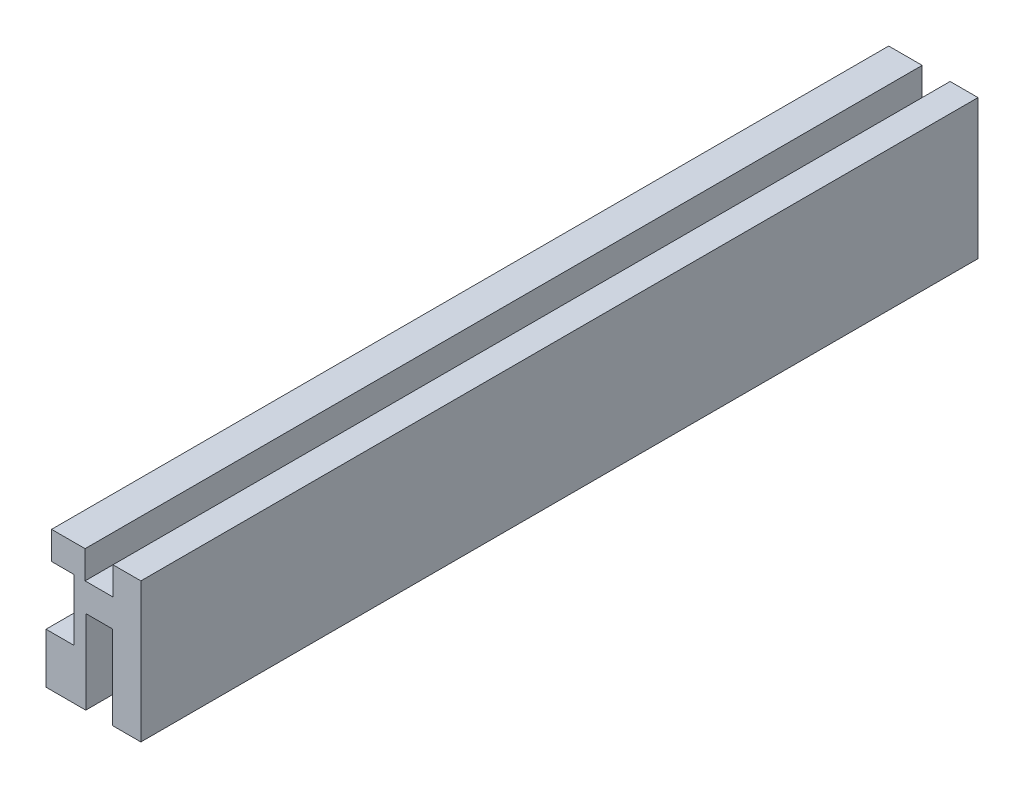
ISO-10303-21;
HEADER;
FILE_DESCRIPTION(('STEP AP214'),'2;1');
FILE_NAME('part.step','',(''),(''),'','','');
FILE_SCHEMA(('AUTOMOTIVE_DESIGN { 1 0 10303 214 1 1 1 1 }'));
ENDSEC;
DATA;
#1=APPLICATION_CONTEXT('core data for automotive mechanical design processes');
#2=APPLICATION_PROTOCOL_DEFINITION('international standard','automotive_design',2000,#1);
#3=PRODUCT_CONTEXT('',#1,'mechanical');
#4=PRODUCT('Part','Part','',(#3));
#5=PRODUCT_RELATED_PRODUCT_CATEGORY('part','',(#4));
#6=PRODUCT_DEFINITION_FORMATION('','',#4);
#7=PRODUCT_DEFINITION_CONTEXT('part definition',#1,'design');
#8=PRODUCT_DEFINITION('design','',#6,#7);
#9=PRODUCT_DEFINITION_SHAPE('','',#8);
#10=(LENGTH_UNIT() NAMED_UNIT(*) SI_UNIT(.MILLI.,.METRE.));
#11=(NAMED_UNIT(*) PLANE_ANGLE_UNIT() SI_UNIT($,.RADIAN.));
#12=(NAMED_UNIT(*) SI_UNIT($,.STERADIAN.) SOLID_ANGLE_UNIT());
#13=UNCERTAINTY_MEASURE_WITH_UNIT(LENGTH_MEASURE(1.E-05),#10,'distance_accuracy_value','');
#14=(GEOMETRIC_REPRESENTATION_CONTEXT(3) GLOBAL_UNCERTAINTY_ASSIGNED_CONTEXT((#13)) GLOBAL_UNIT_ASSIGNED_CONTEXT((#10,
#11,#12)) REPRESENTATION_CONTEXT('',''));
#15=CARTESIAN_POINT('',(0.,0.,0.));
#16=DIRECTION('',(0.,0.,1.));
#17=DIRECTION('',(1.,0.,0.));
#18=AXIS2_PLACEMENT_3D('',#15,#16,#17);
#19=CARTESIAN_POINT('',(15.,-25.,300.));
#20=DIRECTION('',(0.,1.,0.));
#21=DIRECTION('',(-1.,0.,0.));
#22=AXIS2_PLACEMENT_3D('',#19,#20,#21);
#23=PLANE('',#22);
#24=DIRECTION('',(1.,0.,0.));
#25=VECTOR('',#24,1.);
#26=CARTESIAN_POINT('',(15.,-25.,0.));
#27=LINE('',#26,#25);
#28=CARTESIAN_POINT('',(4.75000000000001,-25.,0.));
#29=VERTEX_POINT('',#28);
#30=CARTESIAN_POINT('',(15.,-25.,0.));
#31=VERTEX_POINT('',#30);
#32=EDGE_CURVE('E182',#29,#31,#27,.T.);
#33=ORIENTED_EDGE('',*,*,#32,.T.);
#34=DIRECTION('',(0.,0.,-1.));
#35=VECTOR('',#34,1.);
#36=CARTESIAN_POINT('',(15.,-25.,300.));
#37=LINE('',#36,#35);
#38=CARTESIAN_POINT('',(15.,-25.,300.));
#39=VERTEX_POINT('',#38);
#40=EDGE_CURVE('E11',#39,#31,#37,.T.);
#41=ORIENTED_EDGE('',*,*,#40,.F.);
#42=DIRECTION('',(1.,0.,0.));
#43=VECTOR('',#42,1.);
#44=CARTESIAN_POINT('',(15.,-25.,300.));
#45=LINE('',#44,#43);
#46=CARTESIAN_POINT('',(4.75000000000001,-25.,300.));
#47=VERTEX_POINT('',#46);
#48=EDGE_CURVE('E212',#47,#39,#45,.T.);
#49=ORIENTED_EDGE('',*,*,#48,.F.);
#50=DIRECTION('',(0.,0.,-1.));
#51=VECTOR('',#50,1.);
#52=CARTESIAN_POINT('',(4.75000000000001,-25.,300.));
#53=LINE('',#52,#51);
#54=EDGE_CURVE('E178',#47,#29,#53,.T.);
#55=ORIENTED_EDGE('',*,*,#54,.T.);
#56=EDGE_LOOP('',(#33,#41,#49,#55));
#57=FACE_BOUND('',#56,.T.);
#58=ADVANCED_FACE('F38',(#57),#23,.F.);
#59=CARTESIAN_POINT('',(15.,25.,300.));
#60=DIRECTION('',(-1.,0.,0.));
#61=DIRECTION('',(0.,-1.,0.));
#62=AXIS2_PLACEMENT_3D('',#59,#60,#61);
#63=PLANE('',#62);
#64=DIRECTION('',(0.,1.,0.));
#65=VECTOR('',#64,1.);
#66=CARTESIAN_POINT('',(15.,25.,0.));
#67=LINE('',#66,#65);
#68=CARTESIAN_POINT('',(15.,25.,0.));
#69=VERTEX_POINT('',#68);
#70=EDGE_CURVE('E185',#31,#69,#67,.T.);
#71=ORIENTED_EDGE('',*,*,#70,.T.);
#72=DIRECTION('',(0.,0.,-1.));
#73=VECTOR('',#72,1.);
#74=CARTESIAN_POINT('',(15.,25.,300.));
#75=LINE('',#74,#73);
#76=CARTESIAN_POINT('',(15.,25.,300.));
#77=VERTEX_POINT('',#76);
#78=EDGE_CURVE('E46',#77,#69,#75,.T.);
#79=ORIENTED_EDGE('',*,*,#78,.F.);
#80=DIRECTION('',(0.,1.,0.));
#81=VECTOR('',#80,1.);
#82=CARTESIAN_POINT('',(15.,25.,300.));
#83=LINE('',#82,#81);
#84=EDGE_CURVE('E121',#39,#77,#83,.T.);
#85=ORIENTED_EDGE('',*,*,#84,.F.);
#86=ORIENTED_EDGE('',*,*,#40,.T.);
#87=EDGE_LOOP('',(#71,#79,#85,#86));
#88=FACE_BOUND('',#87,.T.);
#89=ADVANCED_FACE('F310',(#88),#63,.F.);
#90=CARTESIAN_POINT('',(15.,25.,300.));
#91=DIRECTION('',(0.,-1.,0.));
#92=DIRECTION('',(1.,0.,0.));
#93=AXIS2_PLACEMENT_3D('',#90,#91,#92);
#94=PLANE('',#93);
#95=DIRECTION('',(-1.,0.,0.));
#96=VECTOR('',#95,1.);
#97=CARTESIAN_POINT('',(15.,25.,0.));
#98=LINE('',#97,#96);
#99=CARTESIAN_POINT('',(5.00000000000001,25.,0.));
#100=VERTEX_POINT('',#99);
#101=EDGE_CURVE('E187',#69,#100,#98,.T.);
#102=ORIENTED_EDGE('',*,*,#101,.T.);
#103=DIRECTION('',(0.,0.,-1.));
#104=VECTOR('',#103,1.);
#105=CARTESIAN_POINT('',(5.00000000000001,25.,300.));
#106=LINE('',#105,#104);
#107=CARTESIAN_POINT('',(5.00000000000001,25.,300.));
#108=VERTEX_POINT('',#107);
#109=EDGE_CURVE('E243',#108,#100,#106,.T.);
#110=ORIENTED_EDGE('',*,*,#109,.F.);
#111=DIRECTION('',(-1.,0.,0.));
#112=VECTOR('',#111,1.);
#113=CARTESIAN_POINT('',(15.,25.,300.));
#114=LINE('',#113,#112);
#115=EDGE_CURVE('E251',#77,#108,#114,.T.);
#116=ORIENTED_EDGE('',*,*,#115,.F.);
#117=ORIENTED_EDGE('',*,*,#78,.T.);
#118=EDGE_LOOP('',(#102,#110,#116,#117));
#119=FACE_BOUND('',#118,.T.);
#120=ADVANCED_FACE('F249',(#119),#94,.F.);
#121=CARTESIAN_POINT('',(5.00000000000001,25.,300.));
#122=DIRECTION('',(1.,0.,0.));
#123=DIRECTION('',(0.,1.,0.));
#124=AXIS2_PLACEMENT_3D('',#121,#122,#123);
#125=PLANE('',#124);
#126=DIRECTION('',(0.,-1.,0.));
#127=VECTOR('',#126,1.);
#128=CARTESIAN_POINT('',(5.00000000000001,25.,0.));
#129=LINE('',#128,#127);
#130=CARTESIAN_POINT('',(5.00000000000001,15.,0.));
#131=VERTEX_POINT('',#130);
#132=EDGE_CURVE('E189',#100,#131,#129,.T.);
#133=ORIENTED_EDGE('',*,*,#132,.T.);
#134=DIRECTION('',(0.,0.,-1.));
#135=VECTOR('',#134,1.);
#136=CARTESIAN_POINT('',(5.00000000000001,15.,300.));
#137=LINE('',#136,#135);
#138=CARTESIAN_POINT('',(5.00000000000001,15.,300.));
#139=VERTEX_POINT('',#138);
#140=EDGE_CURVE('E240',#139,#131,#137,.T.);
#141=ORIENTED_EDGE('',*,*,#140,.F.);
#142=DIRECTION('',(0.,-1.,0.));
#143=VECTOR('',#142,1.);
#144=CARTESIAN_POINT('',(5.00000000000001,25.,300.));
#145=LINE('',#144,#143);
#146=EDGE_CURVE('E269',#108,#139,#145,.T.);
#147=ORIENTED_EDGE('',*,*,#146,.F.);
#148=ORIENTED_EDGE('',*,*,#109,.T.);
#149=EDGE_LOOP('',(#133,#141,#147,#148));
#150=FACE_BOUND('',#149,.T.);
#151=ADVANCED_FACE('F260',(#150),#125,.F.);
#152=CARTESIAN_POINT('',(-5.,15.,300.));
#153=DIRECTION('',(0.,-1.,0.));
#154=DIRECTION('',(0.,0.,-1.));
#155=AXIS2_PLACEMENT_3D('',#152,#153,#154);
#156=PLANE('',#155);
#157=DIRECTION('',(-1.,0.,0.));
#158=VECTOR('',#157,1.);
#159=CARTESIAN_POINT('',(-5.,15.,0.));
#160=LINE('',#159,#158);
#161=CARTESIAN_POINT('',(-5.,15.,0.));
#162=VERTEX_POINT('',#161);
#163=EDGE_CURVE('E191',#131,#162,#160,.T.);
#164=ORIENTED_EDGE('',*,*,#163,.T.);
#165=DIRECTION('',(0.,0.,-1.));
#166=VECTOR('',#165,1.);
#167=CARTESIAN_POINT('',(-5.,15.,300.));
#168=LINE('',#167,#166);
#169=CARTESIAN_POINT('',(-5.,15.,300.));
#170=VERTEX_POINT('',#169);
#171=EDGE_CURVE('E237',#170,#162,#168,.T.);
#172=ORIENTED_EDGE('',*,*,#171,.F.);
#173=DIRECTION('',(-1.,0.,0.));
#174=VECTOR('',#173,1.);
#175=CARTESIAN_POINT('',(-5.,15.,300.));
#176=LINE('',#175,#174);
#177=EDGE_CURVE('E266',#139,#170,#176,.T.);
#178=ORIENTED_EDGE('',*,*,#177,.F.);
#179=ORIENTED_EDGE('',*,*,#140,.T.);
#180=EDGE_LOOP('',(#164,#172,#178,#179));
#181=FACE_BOUND('',#180,.T.);
#182=ADVANCED_FACE('F264',(#181),#156,.F.);
#183=CARTESIAN_POINT('',(-5.,25.,300.));
#184=DIRECTION('',(-1.,0.,0.));
#185=DIRECTION('',(0.,-1.,0.));
#186=AXIS2_PLACEMENT_3D('',#183,#184,#185);
#187=PLANE('',#186);
#188=DIRECTION('',(0.,1.,0.));
#189=VECTOR('',#188,1.);
#190=CARTESIAN_POINT('',(-5.,25.,0.));
#191=LINE('',#190,#189);
#192=CARTESIAN_POINT('',(-5.,25.,0.));
#193=VERTEX_POINT('',#192);
#194=EDGE_CURVE('E193',#162,#193,#191,.T.);
#195=ORIENTED_EDGE('',*,*,#194,.T.);
#196=DIRECTION('',(0.,0.,-1.));
#197=VECTOR('',#196,1.);
#198=CARTESIAN_POINT('',(-5.,25.,300.));
#199=LINE('',#198,#197);
#200=CARTESIAN_POINT('',(-5.,25.,300.));
#201=VERTEX_POINT('',#200);
#202=EDGE_CURVE('E234',#201,#193,#199,.T.);
#203=ORIENTED_EDGE('',*,*,#202,.F.);
#204=DIRECTION('',(0.,1.,0.));
#205=VECTOR('',#204,1.);
#206=CARTESIAN_POINT('',(-5.,25.,300.));
#207=LINE('',#206,#205);
#208=EDGE_CURVE('E268',#170,#201,#207,.T.);
#209=ORIENTED_EDGE('',*,*,#208,.F.);
#210=ORIENTED_EDGE('',*,*,#171,.T.);
#211=EDGE_LOOP('',(#195,#203,#209,#210));
#212=FACE_BOUND('',#211,.T.);
#213=ADVANCED_FACE('F323',(#212),#187,.F.);
#214=CARTESIAN_POINT('',(-5.,25.,300.));
#215=DIRECTION('',(0.,-1.,0.));
#216=DIRECTION('',(0.,0.,-1.));
#217=AXIS2_PLACEMENT_3D('',#214,#215,#216);
#218=PLANE('',#217);
#219=DIRECTION('',(-1.,0.,0.));
#220=VECTOR('',#219,1.);
#221=CARTESIAN_POINT('',(-5.,25.,0.));
#222=LINE('',#221,#220);
#223=CARTESIAN_POINT('',(-17.,25.,0.));
#224=VERTEX_POINT('',#223);
#225=EDGE_CURVE('E195',#193,#224,#222,.T.);
#226=ORIENTED_EDGE('',*,*,#225,.T.);
#227=DIRECTION('',(0.,0.,-1.));
#228=VECTOR('',#227,1.);
#229=CARTESIAN_POINT('',(-17.,25.,300.));
#230=LINE('',#229,#228);
#231=CARTESIAN_POINT('',(-17.,25.,300.));
#232=VERTEX_POINT('',#231);
#233=EDGE_CURVE('E231',#232,#224,#230,.T.);
#234=ORIENTED_EDGE('',*,*,#233,.F.);
#235=DIRECTION('',(-1.,0.,0.));
#236=VECTOR('',#235,1.);
#237=CARTESIAN_POINT('',(-5.,25.,300.));
#238=LINE('',#237,#236);
#239=EDGE_CURVE('E271',#201,#232,#238,.T.);
#240=ORIENTED_EDGE('',*,*,#239,.F.);
#241=ORIENTED_EDGE('',*,*,#202,.T.);
#242=EDGE_LOOP('',(#226,#234,#240,#241));
#243=FACE_BOUND('',#242,.T.);
#244=ADVANCED_FACE('F326',(#243),#218,.F.);
#245=CARTESIAN_POINT('',(-17.,25.,300.));
#246=DIRECTION('',(1.,0.,0.));
#247=DIRECTION('',(0.,1.,0.));
#248=AXIS2_PLACEMENT_3D('',#245,#246,#247);
#249=PLANE('',#248);
#250=DIRECTION('',(0.,-1.,0.));
#251=VECTOR('',#250,1.);
#252=CARTESIAN_POINT('',(-17.,25.,0.));
#253=LINE('',#252,#251);
#254=CARTESIAN_POINT('',(-17.,15.,0.));
#255=VERTEX_POINT('',#254);
#256=EDGE_CURVE('E197',#224,#255,#253,.T.);
#257=ORIENTED_EDGE('',*,*,#256,.T.);
#258=DIRECTION('',(0.,0.,-1.));
#259=VECTOR('',#258,1.);
#260=CARTESIAN_POINT('',(-17.,15.,300.));
#261=LINE('',#260,#259);
#262=CARTESIAN_POINT('',(-17.,15.,300.));
#263=VERTEX_POINT('',#262);
#264=EDGE_CURVE('E228',#263,#255,#261,.T.);
#265=ORIENTED_EDGE('',*,*,#264,.F.);
#266=DIRECTION('',(0.,-1.,0.));
#267=VECTOR('',#266,1.);
#268=CARTESIAN_POINT('',(-17.,25.,300.));
#269=LINE('',#268,#267);
#270=EDGE_CURVE('E277',#232,#263,#269,.T.);
#271=ORIENTED_EDGE('',*,*,#270,.F.);
#272=ORIENTED_EDGE('',*,*,#233,.T.);
#273=EDGE_LOOP('',(#257,#265,#271,#272));
#274=FACE_BOUND('',#273,.T.);
#275=ADVANCED_FACE('F330',(#274),#249,.F.);
#276=CARTESIAN_POINT('',(-17.,15.,300.));
#277=DIRECTION('',(0.,1.,0.));
#278=DIRECTION('',(0.,0.,1.));
#279=AXIS2_PLACEMENT_3D('',#276,#277,#278);
#280=PLANE('',#279);
#281=DIRECTION('',(1.,0.,0.));
#282=VECTOR('',#281,1.);
#283=CARTESIAN_POINT('',(-17.,15.,0.));
#284=LINE('',#283,#282);
#285=CARTESIAN_POINT('',(-8.99999999999999,15.,0.));
#286=VERTEX_POINT('',#285);
#287=EDGE_CURVE('E199',#255,#286,#284,.T.);
#288=ORIENTED_EDGE('',*,*,#287,.T.);
#289=DIRECTION('',(0.,0.,-1.));
#290=VECTOR('',#289,1.);
#291=CARTESIAN_POINT('',(-8.99999999999999,15.,300.));
#292=LINE('',#291,#290);
#293=CARTESIAN_POINT('',(-8.99999999999999,15.,300.));
#294=VERTEX_POINT('',#293);
#295=EDGE_CURVE('E225',#294,#286,#292,.T.);
#296=ORIENTED_EDGE('',*,*,#295,.F.);
#297=DIRECTION('',(1.,0.,0.));
#298=VECTOR('',#297,1.);
#299=CARTESIAN_POINT('',(-17.,15.,300.));
#300=LINE('',#299,#298);
#301=EDGE_CURVE('E279',#263,#294,#300,.T.);
#302=ORIENTED_EDGE('',*,*,#301,.F.);
#303=ORIENTED_EDGE('',*,*,#264,.T.);
#304=EDGE_LOOP('',(#288,#296,#302,#303));
#305=FACE_BOUND('',#304,.T.);
#306=ADVANCED_FACE('F334',(#305),#280,.F.);
#307=CARTESIAN_POINT('',(-8.99999999999999,15.,300.));
#308=DIRECTION('',(1.,0.,0.));
#309=DIRECTION('',(0.,1.,0.));
#310=AXIS2_PLACEMENT_3D('',#307,#308,#309);
#311=PLANE('',#310);
#312=DIRECTION('',(0.,-1.,0.));
#313=VECTOR('',#312,1.);
#314=CARTESIAN_POINT('',(-8.99999999999999,15.,0.));
#315=LINE('',#314,#313);
#316=CARTESIAN_POINT('',(-8.99999999999998,-7.,0.));
#317=VERTEX_POINT('',#316);
#318=EDGE_CURVE('E201',#286,#317,#315,.T.);
#319=ORIENTED_EDGE('',*,*,#318,.T.);
#320=DIRECTION('',(0.,0.,-1.));
#321=VECTOR('',#320,1.);
#322=CARTESIAN_POINT('',(-8.99999999999998,-7.,300.));
#323=LINE('',#322,#321);
#324=CARTESIAN_POINT('',(-8.99999999999998,-7.,300.));
#325=VERTEX_POINT('',#324);
#326=EDGE_CURVE('E222',#325,#317,#323,.T.);
#327=ORIENTED_EDGE('',*,*,#326,.F.);
#328=DIRECTION('',(0.,-1.,0.));
#329=VECTOR('',#328,1.);
#330=CARTESIAN_POINT('',(-8.99999999999999,15.,300.));
#331=LINE('',#330,#329);
#332=EDGE_CURVE('E281',#294,#325,#331,.T.);
#333=ORIENTED_EDGE('',*,*,#332,.F.);
#334=ORIENTED_EDGE('',*,*,#295,.T.);
#335=EDGE_LOOP('',(#319,#327,#333,#334));
#336=FACE_BOUND('',#335,.T.);
#337=ADVANCED_FACE('F338',(#336),#311,.F.);
#338=CARTESIAN_POINT('',(-8.99999999999998,-7.,300.));
#339=DIRECTION('',(0.,-1.,0.));
#340=DIRECTION('',(1.,0.,0.));
#341=AXIS2_PLACEMENT_3D('',#338,#339,#340);
#342=PLANE('',#341);
#343=DIRECTION('',(-1.,0.,0.));
#344=VECTOR('',#343,1.);
#345=CARTESIAN_POINT('',(-8.99999999999998,-7.,0.));
#346=LINE('',#345,#344);
#347=CARTESIAN_POINT('',(-19.,-7.,0.));
#348=VERTEX_POINT('',#347);
#349=EDGE_CURVE('E203',#317,#348,#346,.T.);
#350=ORIENTED_EDGE('',*,*,#349,.T.);
#351=DIRECTION('',(0.,0.,-1.));
#352=VECTOR('',#351,1.);
#353=CARTESIAN_POINT('',(-19.,-7.,300.));
#354=LINE('',#353,#352);
#355=CARTESIAN_POINT('',(-19.,-7.,300.));
#356=VERTEX_POINT('',#355);
#357=EDGE_CURVE('E219',#356,#348,#354,.T.);
#358=ORIENTED_EDGE('',*,*,#357,.F.);
#359=DIRECTION('',(-1.,0.,0.));
#360=VECTOR('',#359,1.);
#361=CARTESIAN_POINT('',(-8.99999999999998,-7.,300.));
#362=LINE('',#361,#360);
#363=EDGE_CURVE('E283',#325,#356,#362,.T.);
#364=ORIENTED_EDGE('',*,*,#363,.F.);
#365=ORIENTED_EDGE('',*,*,#326,.T.);
#366=EDGE_LOOP('',(#350,#358,#364,#365));
#367=FACE_BOUND('',#366,.T.);
#368=ADVANCED_FACE('F342',(#367),#342,.F.);
#369=CARTESIAN_POINT('',(-19.,-7.,300.));
#370=DIRECTION('',(1.,0.,0.));
#371=DIRECTION('',(0.,0.,-1.));
#372=AXIS2_PLACEMENT_3D('',#369,#370,#371);
#373=PLANE('',#372);
#374=DIRECTION('',(0.,-1.,0.));
#375=VECTOR('',#374,1.);
#376=CARTESIAN_POINT('',(-19.,-7.,0.));
#377=LINE('',#376,#375);
#378=CARTESIAN_POINT('',(-19.,-25.,0.));
#379=VERTEX_POINT('',#378);
#380=EDGE_CURVE('E205',#348,#379,#377,.T.);
#381=ORIENTED_EDGE('',*,*,#380,.T.);
#382=DIRECTION('',(0.,0.,-1.));
#383=VECTOR('',#382,1.);
#384=CARTESIAN_POINT('',(-19.,-25.,300.));
#385=LINE('',#384,#383);
#386=CARTESIAN_POINT('',(-19.,-25.,300.));
#387=VERTEX_POINT('',#386);
#388=EDGE_CURVE('E216',#387,#379,#385,.T.);
#389=ORIENTED_EDGE('',*,*,#388,.F.);
#390=DIRECTION('',(0.,-1.,0.));
#391=VECTOR('',#390,1.);
#392=CARTESIAN_POINT('',(-19.,-7.,300.));
#393=LINE('',#392,#391);
#394=EDGE_CURVE('E285',#356,#387,#393,.T.);
#395=ORIENTED_EDGE('',*,*,#394,.F.);
#396=ORIENTED_EDGE('',*,*,#357,.T.);
#397=EDGE_LOOP('',(#381,#389,#395,#396));
#398=FACE_BOUND('',#397,.T.);
#399=ADVANCED_FACE('F291',(#398),#373,.F.);
#400=CARTESIAN_POINT('',(-19.,-25.,300.));
#401=DIRECTION('',(0.,1.,0.));
#402=DIRECTION('',(0.,0.,1.));
#403=AXIS2_PLACEMENT_3D('',#400,#401,#402);
#404=PLANE('',#403);
#405=DIRECTION('',(1.,0.,0.));
#406=VECTOR('',#405,1.);
#407=CARTESIAN_POINT('',(-19.,-25.,0.));
#408=LINE('',#407,#406);
#409=CARTESIAN_POINT('',(-4.74999999999999,-25.,0.));
#410=VERTEX_POINT('',#409);
#411=EDGE_CURVE('E207',#379,#410,#408,.T.);
#412=ORIENTED_EDGE('',*,*,#411,.T.);
#413=DIRECTION('',(0.,0.,-1.));
#414=VECTOR('',#413,1.);
#415=CARTESIAN_POINT('',(-4.74999999999999,-25.,300.));
#416=LINE('',#415,#414);
#417=CARTESIAN_POINT('',(-4.74999999999999,-25.,300.));
#418=VERTEX_POINT('',#417);
#419=EDGE_CURVE('E173',#418,#410,#416,.T.);
#420=ORIENTED_EDGE('',*,*,#419,.F.);
#421=DIRECTION('',(1.,0.,0.));
#422=VECTOR('',#421,1.);
#423=CARTESIAN_POINT('',(-19.,-25.,300.));
#424=LINE('',#423,#422);
#425=EDGE_CURVE('E164',#387,#418,#424,.T.);
#426=ORIENTED_EDGE('',*,*,#425,.F.);
#427=ORIENTED_EDGE('',*,*,#388,.T.);
#428=EDGE_LOOP('',(#412,#420,#426,#427));
#429=FACE_BOUND('',#428,.T.);
#430=ADVANCED_FACE('F295',(#429),#404,.F.);
#431=CARTESIAN_POINT('',(-4.74999999999999,-25.,300.));
#432=DIRECTION('',(-1.,0.,0.));
#433=DIRECTION('',(0.,0.,1.));
#434=AXIS2_PLACEMENT_3D('',#431,#432,#433);
#435=PLANE('',#434);
#436=DIRECTION('',(0.,1.,0.));
#437=VECTOR('',#436,1.);
#438=CARTESIAN_POINT('',(-4.74999999999999,-25.,0.));
#439=LINE('',#438,#437);
#440=CARTESIAN_POINT('',(-4.74999999999999,5.,0.));
#441=VERTEX_POINT('',#440);
#442=EDGE_CURVE('E172',#410,#441,#439,.T.);
#443=ORIENTED_EDGE('',*,*,#442,.T.);
#444=DIRECTION('',(0.,0.,-1.));
#445=VECTOR('',#444,1.);
#446=CARTESIAN_POINT('',(-4.74999999999999,5.,300.));
#447=LINE('',#446,#445);
#448=CARTESIAN_POINT('',(-4.74999999999999,5.,300.));
#449=VERTEX_POINT('',#448);
#450=EDGE_CURVE('E169',#449,#441,#447,.T.);
#451=ORIENTED_EDGE('',*,*,#450,.F.);
#452=DIRECTION('',(0.,1.,0.));
#453=VECTOR('',#452,1.);
#454=CARTESIAN_POINT('',(-4.74999999999999,-25.,300.));
#455=LINE('',#454,#453);
#456=EDGE_CURVE('E158',#418,#449,#455,.T.);
#457=ORIENTED_EDGE('',*,*,#456,.F.);
#458=ORIENTED_EDGE('',*,*,#419,.T.);
#459=EDGE_LOOP('',(#443,#451,#457,#458));
#460=FACE_BOUND('',#459,.T.);
#461=ADVANCED_FACE('F170',(#460),#435,.F.);
#462=CARTESIAN_POINT('',(-4.74999999999999,5.,300.));
#463=DIRECTION('',(0.,1.,0.));
#464=DIRECTION('',(0.,0.,1.));
#465=AXIS2_PLACEMENT_3D('',#462,#463,#464);
#466=PLANE('',#465);
#467=DIRECTION('',(1.,0.,0.));
#468=VECTOR('',#467,1.);
#469=CARTESIAN_POINT('',(-4.74999999999999,5.,0.));
#470=LINE('',#469,#468);
#471=CARTESIAN_POINT('',(4.75000000000001,5.,0.));
#472=VERTEX_POINT('',#471);
#473=EDGE_CURVE('E107',#441,#472,#470,.T.);
#474=ORIENTED_EDGE('',*,*,#473,.T.);
#475=DIRECTION('',(0.,0.,-1.));
#476=VECTOR('',#475,1.);
#477=CARTESIAN_POINT('',(4.75000000000001,5.,300.));
#478=LINE('',#477,#476);
#479=CARTESIAN_POINT('',(4.75000000000001,5.,300.));
#480=VERTEX_POINT('',#479);
#481=EDGE_CURVE('E174',#480,#472,#478,.T.);
#482=ORIENTED_EDGE('',*,*,#481,.F.);
#483=DIRECTION('',(1.,0.,0.));
#484=VECTOR('',#483,1.);
#485=CARTESIAN_POINT('',(-4.74999999999999,5.,300.));
#486=LINE('',#485,#484);
#487=EDGE_CURVE('E162',#449,#480,#486,.T.);
#488=ORIENTED_EDGE('',*,*,#487,.F.);
#489=ORIENTED_EDGE('',*,*,#450,.T.);
#490=EDGE_LOOP('',(#474,#482,#488,#489));
#491=FACE_BOUND('',#490,.T.);
#492=ADVANCED_FACE('F176',(#491),#466,.F.);
#493=CARTESIAN_POINT('',(4.75000000000001,-25.,300.));
#494=DIRECTION('',(1.,0.,0.));
#495=DIRECTION('',(0.,0.,-1.));
#496=AXIS2_PLACEMENT_3D('',#493,#494,#495);
#497=PLANE('',#496);
#498=DIRECTION('',(0.,-1.,0.));
#499=VECTOR('',#498,1.);
#500=CARTESIAN_POINT('',(4.75000000000001,-25.,0.));
#501=LINE('',#500,#499);
#502=EDGE_CURVE('E113',#472,#29,#501,.T.);
#503=ORIENTED_EDGE('',*,*,#502,.T.);
#504=ORIENTED_EDGE('',*,*,#54,.F.);
#505=DIRECTION('',(0.,-1.,0.));
#506=VECTOR('',#505,1.);
#507=CARTESIAN_POINT('',(4.75000000000001,-25.,300.));
#508=LINE('',#507,#506);
#509=EDGE_CURVE('E54',#480,#47,#508,.T.);
#510=ORIENTED_EDGE('',*,*,#509,.F.);
#511=ORIENTED_EDGE('',*,*,#481,.T.);
#512=EDGE_LOOP('',(#503,#504,#510,#511));
#513=FACE_BOUND('',#512,.T.);
#514=ADVANCED_FACE('F299',(#513),#497,.F.);
#515=CARTESIAN_POINT('',(0.,0.,300.));
#516=DIRECTION('',(0.,0.,-1.));
#517=DIRECTION('',(-1.,0.,0.));
#518=AXIS2_PLACEMENT_3D('',#515,#516,#517);
#519=PLANE('',#518);
#520=ORIENTED_EDGE('',*,*,#48,.T.);
#521=ORIENTED_EDGE('',*,*,#84,.T.);
#522=ORIENTED_EDGE('',*,*,#115,.T.);
#523=ORIENTED_EDGE('',*,*,#146,.T.);
#524=ORIENTED_EDGE('',*,*,#177,.T.);
#525=ORIENTED_EDGE('',*,*,#208,.T.);
#526=ORIENTED_EDGE('',*,*,#239,.T.);
#527=ORIENTED_EDGE('',*,*,#270,.T.);
#528=ORIENTED_EDGE('',*,*,#301,.T.);
#529=ORIENTED_EDGE('',*,*,#332,.T.);
#530=ORIENTED_EDGE('',*,*,#363,.T.);
#531=ORIENTED_EDGE('',*,*,#394,.T.);
#532=ORIENTED_EDGE('',*,*,#425,.T.);
#533=ORIENTED_EDGE('',*,*,#456,.T.);
#534=ORIENTED_EDGE('',*,*,#487,.T.);
#535=ORIENTED_EDGE('',*,*,#509,.T.);
#536=EDGE_LOOP('',(#520,#521,#522,#523,#524,#525,#526,#527,#528,#529,#530,#531,#532,#533,#534,#535));
#537=FACE_BOUND('',#536,.T.);
#538=ADVANCED_FACE('F160',(#537),#519,.F.);
#539=CARTESIAN_POINT('',(0.,0.,0.));
#540=DIRECTION('',(0.,0.,-1.));
#541=DIRECTION('',(-1.,0.,0.));
#542=AXIS2_PLACEMENT_3D('',#539,#540,#541);
#543=PLANE('',#542);
#544=ORIENTED_EDGE('',*,*,#32,.F.);
#545=ORIENTED_EDGE('',*,*,#502,.F.);
#546=ORIENTED_EDGE('',*,*,#473,.F.);
#547=ORIENTED_EDGE('',*,*,#442,.F.);
#548=ORIENTED_EDGE('',*,*,#411,.F.);
#549=ORIENTED_EDGE('',*,*,#380,.F.);
#550=ORIENTED_EDGE('',*,*,#349,.F.);
#551=ORIENTED_EDGE('',*,*,#318,.F.);
#552=ORIENTED_EDGE('',*,*,#287,.F.);
#553=ORIENTED_EDGE('',*,*,#256,.F.);
#554=ORIENTED_EDGE('',*,*,#225,.F.);
#555=ORIENTED_EDGE('',*,*,#194,.F.);
#556=ORIENTED_EDGE('',*,*,#163,.F.);
#557=ORIENTED_EDGE('',*,*,#132,.F.);
#558=ORIENTED_EDGE('',*,*,#101,.F.);
#559=ORIENTED_EDGE('',*,*,#70,.F.);
#560=EDGE_LOOP('',(#544,#545,#546,#547,#548,#549,#550,#551,#552,#553,#554,#555,#556,#557,#558,#559));
#561=FACE_BOUND('',#560,.T.);
#562=ADVANCED_FACE('F255',(#561),#543,.T.);
#563=CLOSED_SHELL('',(#58,#89,#120,#151,#182,#213,#244,#275,#306,#337,#368,#399,#430,#461,#492,
#514,#538,#562));
#564=MANIFOLD_SOLID_BREP('B2',#563);
#565=ADVANCED_BREP_SHAPE_REPRESENTATION('',(#18,#564),#14);
#566=SHAPE_DEFINITION_REPRESENTATION(#9,#565);
ENDSEC;
END-ISO-10303-21;
